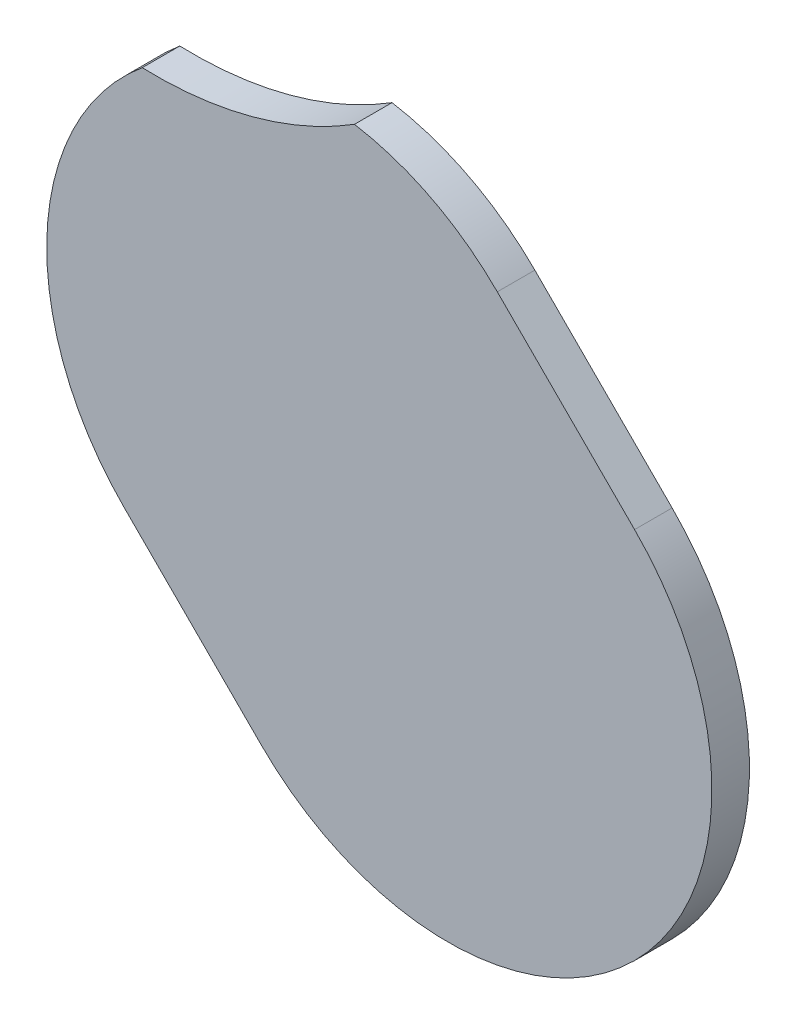
ISO-10303-21;
HEADER;
FILE_DESCRIPTION(('STEP AP214'),'2;1');
FILE_NAME('part.step','',(''),(''),'','','');
FILE_SCHEMA(('AUTOMOTIVE_DESIGN { 1 0 10303 214 1 1 1 1 }'));
ENDSEC;
DATA;
#1=APPLICATION_CONTEXT('core data for automotive mechanical design processes');
#2=APPLICATION_PROTOCOL_DEFINITION('international standard','automotive_design',2000,#1);
#3=PRODUCT_CONTEXT('',#1,'mechanical');
#4=PRODUCT('Part','Part','',(#3));
#5=PRODUCT_RELATED_PRODUCT_CATEGORY('part','',(#4));
#6=PRODUCT_DEFINITION_FORMATION('','',#4);
#7=PRODUCT_DEFINITION_CONTEXT('part definition',#1,'design');
#8=PRODUCT_DEFINITION('design','',#6,#7);
#9=PRODUCT_DEFINITION_SHAPE('','',#8);
#10=(LENGTH_UNIT() NAMED_UNIT(*) SI_UNIT(.MILLI.,.METRE.));
#11=(NAMED_UNIT(*) PLANE_ANGLE_UNIT() SI_UNIT($,.RADIAN.));
#12=(NAMED_UNIT(*) SI_UNIT($,.STERADIAN.) SOLID_ANGLE_UNIT());
#13=UNCERTAINTY_MEASURE_WITH_UNIT(LENGTH_MEASURE(1.E-05),#10,'distance_accuracy_value','');
#14=(GEOMETRIC_REPRESENTATION_CONTEXT(3) GLOBAL_UNCERTAINTY_ASSIGNED_CONTEXT((#13)) GLOBAL_UNIT_ASSIGNED_CONTEXT((#10,
#11,#12)) REPRESENTATION_CONTEXT('',''));
#15=CARTESIAN_POINT('',(0.,0.,0.));
#16=DIRECTION('',(0.,0.,1.));
#17=DIRECTION('',(1.,0.,0.));
#18=AXIS2_PLACEMENT_3D('',#15,#16,#17);
#19=CARTESIAN_POINT('',(87.37055678,108.2753613,0.));
#20=DIRECTION('',(0.707106781186548,0.707106781186548,0.));
#21=DIRECTION('',(0.707106781186548,-0.707106781186548,0.));
#22=AXIS2_PLACEMENT_3D('',#19,#20,#21);
#23=PLANE('',#22);
#24=DIRECTION('',(0.707106781186548,-0.707106781186548,0.));
#25=VECTOR('',#24,1.);
#26=CARTESIAN_POINT('',(87.37055678,108.2753613,0.03556));
#27=LINE('',#26,#25);
#28=CARTESIAN_POINT('',(87.37055678,108.2753613,0.03556));
#29=VERTEX_POINT('',#28);
#30=CARTESIAN_POINT('',(87.50058954,108.14532854,0.03556));
#31=VERTEX_POINT('',#30);
#32=EDGE_CURVE('E11',#29,#31,#27,.T.);
#33=ORIENTED_EDGE('',*,*,#32,.F.);
#34=DIRECTION('',(0.,0.,1.));
#35=VECTOR('',#34,1.);
#36=CARTESIAN_POINT('',(87.37055678,108.2753613,0.));
#37=LINE('',#36,#35);
#38=CARTESIAN_POINT('',(87.37055678,108.2753613,0.));
#39=VERTEX_POINT('',#38);
#40=EDGE_CURVE('E24',#39,#29,#37,.T.);
#41=ORIENTED_EDGE('',*,*,#40,.F.);
#42=DIRECTION('',(0.707106781186548,-0.707106781186548,0.));
#43=VECTOR('',#42,1.);
#44=CARTESIAN_POINT('',(87.37055678,108.2753613,0.));
#45=LINE('',#44,#43);
#46=CARTESIAN_POINT('',(87.50058954,108.14532854,0.));
#47=VERTEX_POINT('',#46);
#48=EDGE_CURVE('E88',#39,#47,#45,.T.);
#49=ORIENTED_EDGE('',*,*,#48,.T.);
#50=DIRECTION('',(0.,0.,1.));
#51=VECTOR('',#50,1.);
#52=CARTESIAN_POINT('',(87.50058954,108.14532854,0.));
#53=LINE('',#52,#51);
#54=EDGE_CURVE('E37',#47,#31,#53,.T.);
#55=ORIENTED_EDGE('',*,*,#54,.T.);
#56=EDGE_LOOP('',(#33,#41,#49,#55));
#57=FACE_BOUND('',#56,.T.);
#58=ADVANCED_FACE('F17',(#57),#23,.F.);
#59=CARTESIAN_POINT('',(87.67736592,108.32210492,0.));
#60=DIRECTION('',(0.,0.,-1.));
#61=DIRECTION('',(-0.707106781186576,-0.707106781186519,0.));
#62=AXIS2_PLACEMENT_3D('',#59,#60,#61);
#63=CYLINDRICAL_SURFACE('',#62,0.249999554103213);
#64=CARTESIAN_POINT('',(87.67736592,108.32210492,0.03556));
#65=DIRECTION('',(0.,0.,1.));
#66=DIRECTION('',(-0.707106781186576,-0.707106781186519,0.));
#67=AXIS2_PLACEMENT_3D('',#64,#65,#66);
#68=CIRCLE('',#67,0.249999554103213);
#69=CARTESIAN_POINT('',(87.8541423,108.4988813,0.03556));
#70=VERTEX_POINT('',#69);
#71=EDGE_CURVE('E121',#31,#70,#68,.T.);
#72=ORIENTED_EDGE('',*,*,#71,.F.);
#73=ORIENTED_EDGE('',*,*,#54,.F.);
#74=CARTESIAN_POINT('',(87.67736592,108.32210492,0.));
#75=DIRECTION('',(0.,0.,1.));
#76=DIRECTION('',(-0.707106781186576,-0.707106781186519,0.));
#77=AXIS2_PLACEMENT_3D('',#74,#75,#76);
#78=CIRCLE('',#77,0.249999554103213);
#79=CARTESIAN_POINT('',(87.8541423,108.4988813,0.));
#80=VERTEX_POINT('',#79);
#81=EDGE_CURVE('E119',#47,#80,#78,.T.);
#82=ORIENTED_EDGE('',*,*,#81,.T.);
#83=DIRECTION('',(0.,0.,1.));
#84=VECTOR('',#83,1.);
#85=CARTESIAN_POINT('',(87.8541423,108.4988813,0.));
#86=LINE('',#85,#84);
#87=EDGE_CURVE('E113',#80,#70,#86,.T.);
#88=ORIENTED_EDGE('',*,*,#87,.T.);
#89=EDGE_LOOP('',(#72,#73,#82,#88));
#90=FACE_BOUND('',#89,.T.);
#91=ADVANCED_FACE('F126',(#90),#63,.T.);
#92=CARTESIAN_POINT('',(87.8541423,108.4988813,0.));
#93=DIRECTION('',(-0.707106781186625,-0.70710678118647,0.));
#94=DIRECTION('',(-0.70710678118647,0.707106781186625,0.));
#95=AXIS2_PLACEMENT_3D('',#92,#93,#94);
#96=PLANE('',#95);
#97=DIRECTION('',(-0.70710678118647,0.707106781186625,0.));
#98=VECTOR('',#97,1.);
#99=CARTESIAN_POINT('',(87.8541423,108.4988813,0.03556));
#100=LINE('',#99,#98);
#101=CARTESIAN_POINT('',(87.72410954,108.62891406,0.03556));
#102=VERTEX_POINT('',#101);
#103=EDGE_CURVE('E105',#70,#102,#100,.T.);
#104=ORIENTED_EDGE('',*,*,#103,.F.);
#105=ORIENTED_EDGE('',*,*,#87,.F.);
#106=DIRECTION('',(-0.70710678118647,0.707106781186625,0.));
#107=VECTOR('',#106,1.);
#108=CARTESIAN_POINT('',(87.8541423,108.4988813,0.));
#109=LINE('',#108,#107);
#110=CARTESIAN_POINT('',(87.72410954,108.62891406,0.));
#111=VERTEX_POINT('',#110);
#112=EDGE_CURVE('E109',#80,#111,#109,.T.);
#113=ORIENTED_EDGE('',*,*,#112,.T.);
#114=DIRECTION('',(0.,0.,1.));
#115=VECTOR('',#114,1.);
#116=CARTESIAN_POINT('',(87.72410954,108.62891406,0.));
#117=LINE('',#116,#115);
#118=EDGE_CURVE('E97',#111,#102,#117,.T.);
#119=ORIENTED_EDGE('',*,*,#118,.T.);
#120=EDGE_LOOP('',(#104,#105,#113,#119));
#121=FACE_BOUND('',#120,.T.);
#122=ADVANCED_FACE('F112',(#121),#96,.F.);
#123=CARTESIAN_POINT('',(87.54733316,108.45213768,0.));
#124=DIRECTION('',(0.,0.,-1.));
#125=DIRECTION('',(0.707106781186548,0.707106781186548,0.));
#126=AXIS2_PLACEMENT_3D('',#123,#124,#125);
#127=CYLINDRICAL_SURFACE('',#126,0.249999554103223);
#128=CARTESIAN_POINT('',(87.54733316,108.45213768,0.03556));
#129=DIRECTION('',(0.,0.,1.));
#130=DIRECTION('',(0.707106781186548,0.707106781186548,0.));
#131=AXIS2_PLACEMENT_3D('',#128,#129,#130);
#132=CIRCLE('',#131,0.249999554103223);
#133=CARTESIAN_POINT('',(87.588817992158,108.698671218799,0.03556));
#134=VERTEX_POINT('',#133);
#135=EDGE_CURVE('E94',#102,#134,#132,.T.);
#136=ORIENTED_EDGE('',*,*,#135,.F.);
#137=ORIENTED_EDGE('',*,*,#118,.F.);
#138=CARTESIAN_POINT('',(87.54733316,108.45213768,0.));
#139=DIRECTION('',(0.,0.,1.));
#140=DIRECTION('',(0.707106781186548,0.707106781186548,0.));
#141=AXIS2_PLACEMENT_3D('',#138,#139,#140);
#142=CIRCLE('',#141,0.249999554103223);
#143=CARTESIAN_POINT('',(87.588817992158,108.698671218799,0.));
#144=VERTEX_POINT('',#143);
#145=EDGE_CURVE('E90',#111,#144,#142,.T.);
#146=ORIENTED_EDGE('',*,*,#145,.T.);
#147=DIRECTION('',(0.,0.,1.));
#148=VECTOR('',#147,1.);
#149=CARTESIAN_POINT('',(87.588817992158,108.698671218799,0.));
#150=LINE('',#149,#148);
#151=EDGE_CURVE('E75',#144,#134,#150,.T.);
#152=ORIENTED_EDGE('',*,*,#151,.T.);
#153=EDGE_LOOP('',(#136,#137,#146,#152));
#154=FACE_BOUND('',#153,.T.);
#155=ADVANCED_FACE('F106',(#154),#127,.T.);
#156=CARTESIAN_POINT('',(87.40000046,109.00000044,0.));
#157=DIRECTION('',(0.,0.,-1.));
#158=DIRECTION('',(1.,0.,0.));
#159=AXIS2_PLACEMENT_3D('',#156,#157,#158);
#160=CYLINDRICAL_SURFACE('',#159,0.3556);
#161=DIRECTION('',(0.,0.,1.));
#162=VECTOR('',#161,1.);
#163=CARTESIAN_POINT('',(87.3877896722091,108.644610152201,0.));
#164=LINE('',#163,#162);
#165=CARTESIAN_POINT('',(87.3877896722091,108.644610152201,0.));
#166=VERTEX_POINT('',#165);
#167=CARTESIAN_POINT('',(87.3877896722091,108.644610152201,0.03556));
#168=VERTEX_POINT('',#167);
#169=EDGE_CURVE('E65',#166,#168,#164,.T.);
#170=ORIENTED_EDGE('',*,*,#169,.T.);
#171=CARTESIAN_POINT('',(87.40000046,109.00000044,0.03556));
#172=DIRECTION('',(0.,0.,1.));
#173=DIRECTION('',(1.,0.,0.));
#174=AXIS2_PLACEMENT_3D('',#171,#172,#173);
#175=CIRCLE('',#174,0.3556);
#176=EDGE_CURVE('E76',#168,#134,#175,.T.);
#177=ORIENTED_EDGE('',*,*,#176,.T.);
#178=ORIENTED_EDGE('',*,*,#151,.F.);
#179=CARTESIAN_POINT('',(87.40000046,109.00000044,0.));
#180=DIRECTION('',(0.,0.,1.));
#181=DIRECTION('',(1.,0.,0.));
#182=AXIS2_PLACEMENT_3D('',#179,#180,#181);
#183=CIRCLE('',#182,0.3556);
#184=EDGE_CURVE('E79',#166,#144,#183,.T.);
#185=ORIENTED_EDGE('',*,*,#184,.F.);
#186=EDGE_LOOP('',(#170,#177,#178,#185));
#187=FACE_BOUND('',#186,.T.);
#188=ADVANCED_FACE('F80',(#187),#160,.F.);
#189=CARTESIAN_POINT('',(87.54733316,108.45213768,0.));
#190=DIRECTION('',(0.,0.,-1.));
#191=DIRECTION('',(0.707106781186548,0.707106781186548,0.));
#192=AXIS2_PLACEMENT_3D('',#189,#190,#191);
#193=CYLINDRICAL_SURFACE('',#192,0.249999554103223);
#194=CARTESIAN_POINT('',(87.54733316,108.45213768,0.03556));
#195=DIRECTION('',(0.,0.,1.));
#196=DIRECTION('',(0.707106781186548,0.707106781186548,0.));
#197=AXIS2_PLACEMENT_3D('',#194,#195,#196);
#198=CIRCLE('',#197,0.249999554103223);
#199=EDGE_CURVE('E71',#168,#29,#198,.T.);
#200=ORIENTED_EDGE('',*,*,#199,.F.);
#201=ORIENTED_EDGE('',*,*,#169,.F.);
#202=EDGE_CURVE('E69',#166,#39,#142,.T.);
#203=ORIENTED_EDGE('',*,*,#202,.T.);
#204=ORIENTED_EDGE('',*,*,#40,.T.);
#205=EDGE_LOOP('',(#200,#201,#203,#204));
#206=FACE_BOUND('',#205,.T.);
#207=ADVANCED_FACE('F67',(#206),#193,.T.);
#208=CARTESIAN_POINT('',(87.37055678,108.2753613,0.));
#209=DIRECTION('',(0.,0.,-1.));
#210=DIRECTION('',(-1.,0.,0.));
#211=AXIS2_PLACEMENT_3D('',#208,#209,#210);
#212=PLANE('',#211);
#213=ORIENTED_EDGE('',*,*,#48,.F.);
#214=ORIENTED_EDGE('',*,*,#202,.F.);
#215=ORIENTED_EDGE('',*,*,#184,.T.);
#216=ORIENTED_EDGE('',*,*,#145,.F.);
#217=ORIENTED_EDGE('',*,*,#112,.F.);
#218=ORIENTED_EDGE('',*,*,#81,.F.);
#219=EDGE_LOOP('',(#213,#214,#215,#216,#217,#218));
#220=FACE_BOUND('',#219,.T.);
#221=ADVANCED_FACE('F86',(#220),#212,.T.);
#222=CARTESIAN_POINT('',(87.37055678,108.2753613,0.03556));
#223=DIRECTION('',(0.,0.,-1.));
#224=DIRECTION('',(-1.,0.,0.));
#225=AXIS2_PLACEMENT_3D('',#222,#223,#224);
#226=PLANE('',#225);
#227=ORIENTED_EDGE('',*,*,#199,.T.);
#228=ORIENTED_EDGE('',*,*,#32,.T.);
#229=ORIENTED_EDGE('',*,*,#71,.T.);
#230=ORIENTED_EDGE('',*,*,#103,.T.);
#231=ORIENTED_EDGE('',*,*,#135,.T.);
#232=ORIENTED_EDGE('',*,*,#176,.F.);
#233=EDGE_LOOP('',(#227,#228,#229,#230,#231,#232));
#234=FACE_BOUND('',#233,.T.);
#235=ADVANCED_FACE('F101',(#234),#226,.F.);
#236=CLOSED_SHELL('',(#58,#91,#122,#155,#188,#207,#221,#235));
#237=MANIFOLD_SOLID_BREP('B1',#236);
#238=ADVANCED_BREP_SHAPE_REPRESENTATION('',(#18,#237),#14);
#239=SHAPE_DEFINITION_REPRESENTATION(#9,#238);
ENDSEC;
END-ISO-10303-21;
